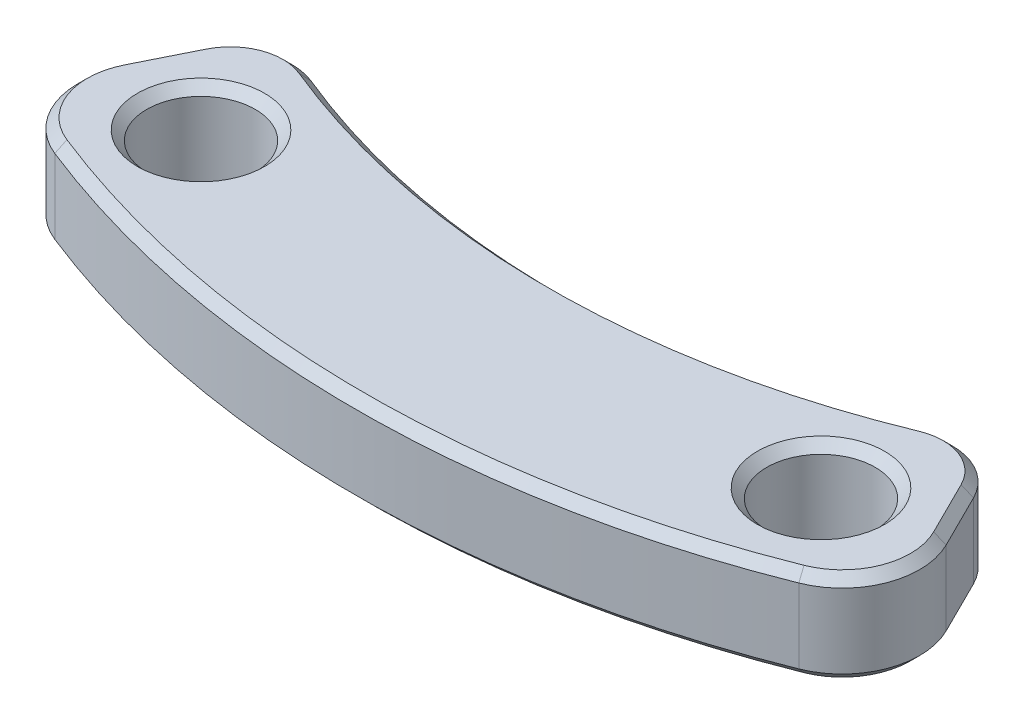
ISO-10303-21;
HEADER;
FILE_DESCRIPTION(('STEP AP214'),'2;1');
FILE_NAME('part.step','',(''),(''),'','','');
FILE_SCHEMA(('AUTOMOTIVE_DESIGN { 1 0 10303 214 1 1 1 1 }'));
ENDSEC;
DATA;
#1=APPLICATION_CONTEXT('core data for automotive mechanical design processes');
#2=APPLICATION_PROTOCOL_DEFINITION('international standard','automotive_design',2000,#1);
#3=PRODUCT_CONTEXT('',#1,'mechanical');
#4=PRODUCT('Part','Part','',(#3));
#5=PRODUCT_RELATED_PRODUCT_CATEGORY('part','',(#4));
#6=PRODUCT_DEFINITION_FORMATION('','',#4);
#7=PRODUCT_DEFINITION_CONTEXT('part definition',#1,'design');
#8=PRODUCT_DEFINITION('design','',#6,#7);
#9=PRODUCT_DEFINITION_SHAPE('','',#8);
#10=(LENGTH_UNIT() NAMED_UNIT(*) SI_UNIT(.MILLI.,.METRE.));
#11=(NAMED_UNIT(*) PLANE_ANGLE_UNIT() SI_UNIT($,.RADIAN.));
#12=(NAMED_UNIT(*) SI_UNIT($,.STERADIAN.) SOLID_ANGLE_UNIT());
#13=UNCERTAINTY_MEASURE_WITH_UNIT(LENGTH_MEASURE(1.E-05),#10,'distance_accuracy_value','');
#14=(GEOMETRIC_REPRESENTATION_CONTEXT(3) GLOBAL_UNCERTAINTY_ASSIGNED_CONTEXT((#13)) GLOBAL_UNIT_ASSIGNED_CONTEXT((#10,
#11,#12)) REPRESENTATION_CONTEXT('',''));
#15=CARTESIAN_POINT('',(0.,0.,0.));
#16=DIRECTION('',(0.,0.,1.));
#17=DIRECTION('',(1.,0.,0.));
#18=AXIS2_PLACEMENT_3D('',#15,#16,#17);
#19=CARTESIAN_POINT('',(15.4583046046748,3.,-0.411804340126796));
#20=DIRECTION('',(0.,1.,0.));
#21=DIRECTION('',(0.,0.,1.));
#22=AXIS2_PLACEMENT_3D('',#19,#20,#21);
#23=PLANE('',#22);
#24=CARTESIAN_POINT('',(14.3811814983377,3.,-0.804359974369999));
#25=DIRECTION('',(0.,1.,0.));
#26=DIRECTION('',(0.,0.,1.));
#27=AXIS2_PLACEMENT_3D('',#24,#25,#26);
#28=CIRCLE('',#27,2.04999999999999);
#29=CARTESIAN_POINT('',(14.3811814983377,3.,1.24564002562999));
#30=VERTEX_POINT('',#29);
#31=EDGE_CURVE('E326',#30,#30,#28,.F.);
#32=ORIENTED_EDGE('',*,*,#31,.T.);
#33=EDGE_LOOP('',(#32));
#34=FACE_BOUND('',#33,.T.);
#35=CARTESIAN_POINT('',(-5.61881850166235,3.,-0.804359974369999));
#36=DIRECTION('',(0.,1.,0.));
#37=DIRECTION('',(0.,0.,1.));
#38=AXIS2_PLACEMENT_3D('',#35,#36,#37);
#39=CIRCLE('',#38,2.04999999999999);
#40=CARTESIAN_POINT('',(-5.61881850166235,3.,1.24564002562999));
#41=VERTEX_POINT('',#40);
#42=EDGE_CURVE('E323',#41,#41,#39,.F.);
#43=ORIENTED_EDGE('',*,*,#42,.T.);
#44=EDGE_LOOP('',(#43));
#45=FACE_BOUND('',#44,.T.);
#46=CARTESIAN_POINT('',(-6.69594160799948,3.,-0.411804340126796));
#47=DIRECTION('',(0.,1.,0.));
#48=DIRECTION('',(0.,0.,1.));
#49=AXIS2_PLACEMENT_3D('',#46,#47,#48);
#50=CIRCLE('',#49,2.20000000000001);
#51=CARTESIAN_POINT('',(-8.66567382735264,3.,-1.39167932401103));
#52=VERTEX_POINT('',#51);
#53=CARTESIAN_POINT('',(-7.50826396913086,3.,1.63273286462297));
#54=VERTEX_POINT('',#53);
#55=EDGE_CURVE('E316',#52,#54,#50,.T.);
#56=ORIENTED_EDGE('',*,*,#55,.T.);
#57=CARTESIAN_POINT('',(4.38118149833765,3.,-28.2918571321689));
#58=DIRECTION('',(0.,1.,0.));
#59=DIRECTION('',(0.,0.,1.));
#60=AXIS2_PLACEMENT_3D('',#57,#58,#59);
#61=CIRCLE('',#60,32.2);
#62=CARTESIAN_POINT('',(16.2706269658062,3.,1.63273286462296));
#63=VERTEX_POINT('',#62);
#64=EDGE_CURVE('E320',#54,#63,#61,.T.);
#65=ORIENTED_EDGE('',*,*,#64,.T.);
#66=CARTESIAN_POINT('',(15.4583046046748,3.,-0.411804340126796));
#67=DIRECTION('',(0.,1.,0.));
#68=DIRECTION('',(0.,0.,1.));
#69=AXIS2_PLACEMENT_3D('',#66,#67,#68);
#70=CIRCLE('',#69,2.20000000000001);
#71=CARTESIAN_POINT('',(17.4280368240279,3.,-1.39167932401102));
#72=VERTEX_POINT('',#71);
#73=EDGE_CURVE('E318',#63,#72,#70,.T.);
#74=ORIENTED_EDGE('',*,*,#73,.T.);
#75=DIRECTION('',(-0.445397719947376,0.,-0.895332826978705));
#76=VECTOR('',#75,1.);
#77=CARTESIAN_POINT('',(16.5518630028291,3.,-3.15295278619088));
#78=LINE('',#77,#76);
#79=CARTESIAN_POINT('',(16.5518630028291,3.,-3.15295278619088));
#80=VERTEX_POINT('',#79);
#81=EDGE_CURVE('E314',#72,#80,#78,.T.);
#82=ORIENTED_EDGE('',*,*,#81,.T.);
#83=CARTESIAN_POINT('',(15.0297971969653,3.,-2.39577666228034));
#84=DIRECTION('',(0.,1.,0.));
#85=DIRECTION('',(0.,0.,1.));
#86=AXIS2_PLACEMENT_3D('',#83,#84,#85);
#87=CIRCLE('',#86,1.70000000000001);
#88=CARTESIAN_POINT('',(14.3832741009771,3.,-3.96803869080929));
#89=VERTEX_POINT('',#88);
#90=EDGE_CURVE('E310',#80,#89,#87,.T.);
#91=ORIENTED_EDGE('',*,*,#90,.T.);
#92=CARTESIAN_POINT('',(4.38118149833765,3.,-28.2918571321689));
#93=DIRECTION('',(0.,1.,0.));
#94=DIRECTION('',(0.,0.,1.));
#95=AXIS2_PLACEMENT_3D('',#92,#93,#94);
#96=CIRCLE('',#95,26.3);
#97=CARTESIAN_POINT('',(-5.62091110430185,3.,-3.96803869080929));
#98=VERTEX_POINT('',#97);
#99=EDGE_CURVE('E306',#89,#98,#96,.F.);
#100=ORIENTED_EDGE('',*,*,#99,.T.);
#101=CARTESIAN_POINT('',(-6.26743420028995,3.,-2.39577666228034));
#102=DIRECTION('',(0.,1.,0.));
#103=DIRECTION('',(0.,0.,1.));
#104=AXIS2_PLACEMENT_3D('',#101,#102,#103);
#105=CIRCLE('',#104,1.70000000000001);
#106=CARTESIAN_POINT('',(-7.78950000615376,3.,-3.15295278619088));
#107=VERTEX_POINT('',#106);
#108=EDGE_CURVE('E308',#98,#107,#105,.T.);
#109=ORIENTED_EDGE('',*,*,#108,.T.);
#110=DIRECTION('',(-0.445397719947375,0.,0.895332826978705));
#111=VECTOR('',#110,1.);
#112=CARTESIAN_POINT('',(-8.66567382735264,3.,-1.39167932401103));
#113=LINE('',#112,#111);
#114=EDGE_CURVE('E312',#107,#52,#113,.T.);
#115=ORIENTED_EDGE('',*,*,#114,.T.);
#116=EDGE_LOOP('',(#56,#65,#74,#82,#91,#100,#109,#115));
#117=FACE_BOUND('',#116,.T.);
#118=ADVANCED_FACE('F41',(#34,#45,#117),#23,.T.);
#119=CARTESIAN_POINT('',(15.4583046046748,0.,-0.411804340126796));
#120=DIRECTION('',(0.,1.,0.));
#121=DIRECTION('',(0.,0.,1.));
#122=AXIS2_PLACEMENT_3D('',#119,#120,#121);
#123=PLANE('',#122);
#124=CARTESIAN_POINT('',(14.3811814983377,0.,-0.804359974369999));
#125=DIRECTION('',(0.,1.,0.));
#126=DIRECTION('',(0.,0.,1.));
#127=AXIS2_PLACEMENT_3D('',#124,#125,#126);
#128=CIRCLE('',#127,2.04999999999999);
#129=CARTESIAN_POINT('',(14.3811814983377,0.,1.24564002562999));
#130=VERTEX_POINT('',#129);
#131=EDGE_CURVE('E297',#130,#130,#128,.T.);
#132=ORIENTED_EDGE('',*,*,#131,.T.);
#133=EDGE_LOOP('',(#132));
#134=FACE_BOUND('',#133,.T.);
#135=CARTESIAN_POINT('',(-5.61881850166235,0.,-0.804359974369999));
#136=DIRECTION('',(0.,1.,0.));
#137=DIRECTION('',(0.,0.,1.));
#138=AXIS2_PLACEMENT_3D('',#135,#136,#137);
#139=CIRCLE('',#138,2.05);
#140=CARTESIAN_POINT('',(-5.61881850166235,0.,1.24564002563));
#141=VERTEX_POINT('',#140);
#142=EDGE_CURVE('E294',#141,#141,#139,.T.);
#143=ORIENTED_EDGE('',*,*,#142,.T.);
#144=EDGE_LOOP('',(#143));
#145=FACE_BOUND('',#144,.T.);
#146=CARTESIAN_POINT('',(-6.26743420028995,0.,-2.39577666228034));
#147=DIRECTION('',(0.,1.,0.));
#148=DIRECTION('',(0.,0.,1.));
#149=AXIS2_PLACEMENT_3D('',#146,#147,#148);
#150=CIRCLE('',#149,1.7);
#151=CARTESIAN_POINT('',(-7.78950000615376,0.,-3.15295278619088));
#152=VERTEX_POINT('',#151);
#153=CARTESIAN_POINT('',(-5.62091110430185,0.,-3.96803869080928));
#154=VERTEX_POINT('',#153);
#155=EDGE_CURVE('E289',#152,#154,#150,.F.);
#156=ORIENTED_EDGE('',*,*,#155,.T.);
#157=CARTESIAN_POINT('',(4.38118149833765,0.,-28.2918571321689));
#158=DIRECTION('',(0.,1.,0.));
#159=DIRECTION('',(0.,0.,1.));
#160=AXIS2_PLACEMENT_3D('',#157,#158,#159);
#161=CIRCLE('',#160,26.3);
#162=CARTESIAN_POINT('',(14.3832741009772,0.,-3.96803869080929));
#163=VERTEX_POINT('',#162);
#164=EDGE_CURVE('E291',#154,#163,#161,.T.);
#165=ORIENTED_EDGE('',*,*,#164,.T.);
#166=CARTESIAN_POINT('',(15.0297971969653,0.,-2.39577666228034));
#167=DIRECTION('',(0.,1.,0.));
#168=DIRECTION('',(0.,0.,1.));
#169=AXIS2_PLACEMENT_3D('',#166,#167,#168);
#170=CIRCLE('',#169,1.7);
#171=CARTESIAN_POINT('',(16.551863002829,0.,-3.15295278619088));
#172=VERTEX_POINT('',#171);
#173=EDGE_CURVE('E287',#163,#172,#170,.F.);
#174=ORIENTED_EDGE('',*,*,#173,.T.);
#175=DIRECTION('',(0.445397719947376,0.,0.895332826978705));
#176=VECTOR('',#175,1.);
#177=CARTESIAN_POINT('',(17.4280368240279,0.,-1.39167932401102));
#178=LINE('',#177,#176);
#179=CARTESIAN_POINT('',(17.4280368240279,0.,-1.39167932401102));
#180=VERTEX_POINT('',#179);
#181=EDGE_CURVE('E162',#172,#180,#178,.T.);
#182=ORIENTED_EDGE('',*,*,#181,.T.);
#183=CARTESIAN_POINT('',(15.4583046046748,0.,-0.411804340126796));
#184=DIRECTION('',(0.,1.,0.));
#185=DIRECTION('',(0.,0.,1.));
#186=AXIS2_PLACEMENT_3D('',#183,#184,#185);
#187=CIRCLE('',#186,2.2);
#188=CARTESIAN_POINT('',(16.2706269658062,0.,1.63273286462295));
#189=VERTEX_POINT('',#188);
#190=EDGE_CURVE('E156',#180,#189,#187,.F.);
#191=ORIENTED_EDGE('',*,*,#190,.T.);
#192=CARTESIAN_POINT('',(4.38118149833765,0.,-28.2918571321689));
#193=DIRECTION('',(0.,1.,0.));
#194=DIRECTION('',(0.,0.,1.));
#195=AXIS2_PLACEMENT_3D('',#192,#193,#194);
#196=CIRCLE('',#195,32.2);
#197=CARTESIAN_POINT('',(-7.50826396913086,0.,1.63273286462295));
#198=VERTEX_POINT('',#197);
#199=EDGE_CURVE('E159',#189,#198,#196,.F.);
#200=ORIENTED_EDGE('',*,*,#199,.T.);
#201=CARTESIAN_POINT('',(-6.69594160799948,0.,-0.411804340126796));
#202=DIRECTION('',(0.,1.,0.));
#203=DIRECTION('',(0.,0.,1.));
#204=AXIS2_PLACEMENT_3D('',#201,#202,#203);
#205=CIRCLE('',#204,2.2);
#206=CARTESIAN_POINT('',(-8.66567382735263,0.,-1.39167932401102));
#207=VERTEX_POINT('',#206);
#208=EDGE_CURVE('E167',#198,#207,#205,.F.);
#209=ORIENTED_EDGE('',*,*,#208,.T.);
#210=DIRECTION('',(0.445397719947375,0.,-0.895332826978705));
#211=VECTOR('',#210,1.);
#212=CARTESIAN_POINT('',(-4.27073376148586,0.,-10.2263318993305));
#213=LINE('',#212,#211);
#214=EDGE_CURVE('E285',#207,#152,#213,.T.);
#215=ORIENTED_EDGE('',*,*,#214,.T.);
#216=EDGE_LOOP('',(#156,#165,#174,#182,#191,#200,#209,#215));
#217=FACE_BOUND('',#216,.T.);
#218=ADVANCED_FACE('F158',(#134,#145,#217),#123,.F.);
#219=CARTESIAN_POINT('',(15.4583046046748,3.,-0.411804340126796));
#220=DIRECTION('',(0.,-1.,0.));
#221=DIRECTION('',(0.,0.,-1.));
#222=AXIS2_PLACEMENT_3D('',#219,#220,#221);
#223=CYLINDRICAL_SURFACE('',#222,2.5);
#224=DIRECTION('',(0.,-1.,0.));
#225=VECTOR('',#224,1.);
#226=CARTESIAN_POINT('',(16.3813981968695,3.,1.91153339254338));
#227=LINE('',#226,#225);
#228=CARTESIAN_POINT('',(16.3813981968695,2.70000000000001,1.91153339254338));
#229=VERTEX_POINT('',#228);
#230=CARTESIAN_POINT('',(16.3813981968695,0.300000000000002,1.91153339254338));
#231=VERTEX_POINT('',#230);
#232=EDGE_CURVE('E181',#229,#231,#227,.T.);
#233=ORIENTED_EDGE('',*,*,#232,.T.);
#234=CARTESIAN_POINT('',(15.4583046046748,0.300000000000002,-0.411804340126796));
#235=DIRECTION('',(0.,1.,0.));
#236=DIRECTION('',(0.,0.,1.));
#237=AXIS2_PLACEMENT_3D('',#234,#235,#236);
#238=CIRCLE('',#237,2.5);
#239=CARTESIAN_POINT('',(17.6966366721215,0.300000000000002,-1.52529863999523));
#240=VERTEX_POINT('',#239);
#241=EDGE_CURVE('E180',#231,#240,#238,.T.);
#242=ORIENTED_EDGE('',*,*,#241,.T.);
#243=DIRECTION('',(0.,-1.,0.));
#244=VECTOR('',#243,1.);
#245=CARTESIAN_POINT('',(17.6966366721215,3.,-1.52529863999523));
#246=LINE('',#245,#244);
#247=CARTESIAN_POINT('',(17.6966366721215,2.70000000000001,-1.52529863999523));
#248=VERTEX_POINT('',#247);
#249=EDGE_CURVE('E177',#248,#240,#246,.T.);
#250=ORIENTED_EDGE('',*,*,#249,.F.);
#251=CARTESIAN_POINT('',(15.4583046046748,2.70000000000001,-0.411804340126796));
#252=DIRECTION('',(0.,1.,0.));
#253=DIRECTION('',(0.,0.,1.));
#254=AXIS2_PLACEMENT_3D('',#251,#252,#253);
#255=CIRCLE('',#254,2.5);
#256=EDGE_CURVE('E64',#248,#229,#255,.F.);
#257=ORIENTED_EDGE('',*,*,#256,.T.);
#258=EDGE_LOOP('',(#233,#242,#250,#257));
#259=FACE_BOUND('',#258,.T.);
#260=ADVANCED_FACE('F404',(#259),#223,.T.);
#261=CARTESIAN_POINT('',(16.8204628509227,3.,-3.28657210217509));
#262=DIRECTION('',(-0.895332826978705,0.,0.445397719947376));
#263=DIRECTION('',(0.445397719947376,0.,0.895332826978705));
#264=AXIS2_PLACEMENT_3D('',#261,#262,#263);
#265=PLANE('',#264);
#266=ORIENTED_EDGE('',*,*,#249,.T.);
#267=DIRECTION('',(-0.445397719947376,0.,-0.895332826978705));
#268=VECTOR('',#267,1.);
#269=CARTESIAN_POINT('',(16.8204628509227,0.300000000000002,-3.28657210217509));
#270=LINE('',#269,#268);
#271=CARTESIAN_POINT('',(16.8204628509227,0.300000000000002,-3.28657210217509));
#272=VERTEX_POINT('',#271);
#273=EDGE_CURVE('E238',#240,#272,#270,.T.);
#274=ORIENTED_EDGE('',*,*,#273,.T.);
#275=DIRECTION('',(0.,-1.,0.));
#276=VECTOR('',#275,1.);
#277=CARTESIAN_POINT('',(16.8204628509227,3.,-3.28657210217509));
#278=LINE('',#277,#276);
#279=CARTESIAN_POINT('',(16.8204628509227,2.70000000000001,-3.28657210217509));
#280=VERTEX_POINT('',#279);
#281=EDGE_CURVE('E280',#280,#272,#278,.T.);
#282=ORIENTED_EDGE('',*,*,#281,.F.);
#283=DIRECTION('',(0.445397719947376,0.,0.895332826978705));
#284=VECTOR('',#283,1.);
#285=CARTESIAN_POINT('',(17.6966366721215,2.70000000000001,-1.52529863999523));
#286=LINE('',#285,#284);
#287=EDGE_CURVE('E245',#280,#248,#286,.T.);
#288=ORIENTED_EDGE('',*,*,#287,.T.);
#289=EDGE_LOOP('',(#266,#274,#282,#288));
#290=FACE_BOUND('',#289,.T.);
#291=ADVANCED_FACE('F424',(#290),#265,.F.);
#292=CARTESIAN_POINT('',(15.0297971969653,3.,-2.39577666228034));
#293=DIRECTION('',(0.,-1.,0.));
#294=DIRECTION('',(0.,0.,-1.));
#295=AXIS2_PLACEMENT_3D('',#292,#293,#294);
#296=CYLINDRICAL_SURFACE('',#295,2.);
#297=ORIENTED_EDGE('',*,*,#281,.T.);
#298=CARTESIAN_POINT('',(15.0297971969653,0.300000000000002,-2.39577666228034));
#299=DIRECTION('',(0.,1.,0.));
#300=DIRECTION('',(0.,0.,1.));
#301=AXIS2_PLACEMENT_3D('',#298,#299,#300);
#302=CIRCLE('',#301,2.);
#303=CARTESIAN_POINT('',(14.2691817899204,0.300000000000002,-4.24549669584381));
#304=VERTEX_POINT('',#303);
#305=EDGE_CURVE('E346',#272,#304,#302,.T.);
#306=ORIENTED_EDGE('',*,*,#305,.T.);
#307=DIRECTION('',(0.,-1.,0.));
#308=VECTOR('',#307,1.);
#309=CARTESIAN_POINT('',(14.2691817899204,3.,-4.24549669584381));
#310=LINE('',#309,#308);
#311=CARTESIAN_POINT('',(14.2691817899204,2.70000000000001,-4.24549669584381));
#312=VERTEX_POINT('',#311);
#313=EDGE_CURVE('E277',#312,#304,#310,.T.);
#314=ORIENTED_EDGE('',*,*,#313,.F.);
#315=CARTESIAN_POINT('',(15.0297971969653,2.70000000000001,-2.39577666228034));
#316=DIRECTION('',(0.,1.,0.));
#317=DIRECTION('',(0.,0.,1.));
#318=AXIS2_PLACEMENT_3D('',#315,#316,#317);
#319=CIRCLE('',#318,2.);
#320=EDGE_CURVE('E344',#312,#280,#319,.F.);
#321=ORIENTED_EDGE('',*,*,#320,.T.);
#322=EDGE_LOOP('',(#297,#306,#314,#321));
#323=FACE_BOUND('',#322,.T.);
#324=ADVANCED_FACE('F386',(#323),#296,.T.);
#325=CARTESIAN_POINT('',(4.38118149833765,3.,-28.2918571321689));
#326=DIRECTION('',(0.,-1.,0.));
#327=DIRECTION('',(0.,0.,-1.));
#328=AXIS2_PLACEMENT_3D('',#325,#326,#327);
#329=CYLINDRICAL_SURFACE('',#328,26.);
#330=ORIENTED_EDGE('',*,*,#313,.T.);
#331=CARTESIAN_POINT('',(4.38118149833765,0.300000000000002,-28.2918571321689));
#332=DIRECTION('',(0.,1.,0.));
#333=DIRECTION('',(0.,0.,1.));
#334=AXIS2_PLACEMENT_3D('',#331,#332,#333);
#335=CIRCLE('',#334,26.);
#336=CARTESIAN_POINT('',(-5.50681879324512,0.300000000000002,-4.24549669584381));
#337=VERTEX_POINT('',#336);
#338=EDGE_CURVE('E337',#304,#337,#335,.F.);
#339=ORIENTED_EDGE('',*,*,#338,.T.);
#340=DIRECTION('',(0.,-1.,0.));
#341=VECTOR('',#340,1.);
#342=CARTESIAN_POINT('',(-5.50681879324512,3.,-4.24549669584381));
#343=LINE('',#342,#341);
#344=CARTESIAN_POINT('',(-5.50681879324512,2.70000000000001,-4.24549669584381));
#345=VERTEX_POINT('',#344);
#346=EDGE_CURVE('E274',#345,#337,#343,.T.);
#347=ORIENTED_EDGE('',*,*,#346,.F.);
#348=CARTESIAN_POINT('',(4.38118149833765,2.70000000000001,-28.2918571321689));
#349=DIRECTION('',(0.,1.,0.));
#350=DIRECTION('',(0.,0.,1.));
#351=AXIS2_PLACEMENT_3D('',#348,#349,#350);
#352=CIRCLE('',#351,26.);
#353=EDGE_CURVE('E335',#345,#312,#352,.T.);
#354=ORIENTED_EDGE('',*,*,#353,.T.);
#355=EDGE_LOOP('',(#330,#339,#347,#354));
#356=FACE_BOUND('',#355,.T.);
#357=ADVANCED_FACE('F370',(#356),#329,.F.);
#358=CARTESIAN_POINT('',(-6.26743420028995,3.,-2.39577666228034));
#359=DIRECTION('',(0.,-1.,0.));
#360=DIRECTION('',(0.,0.,-1.));
#361=AXIS2_PLACEMENT_3D('',#358,#359,#360);
#362=CYLINDRICAL_SURFACE('',#361,2.);
#363=ORIENTED_EDGE('',*,*,#346,.T.);
#364=CARTESIAN_POINT('',(-6.26743420028995,0.300000000000002,-2.39577666228034));
#365=DIRECTION('',(0.,1.,0.));
#366=DIRECTION('',(0.,0.,1.));
#367=AXIS2_PLACEMENT_3D('',#364,#365,#366);
#368=CIRCLE('',#367,2.);
#369=CARTESIAN_POINT('',(-8.05809985424736,0.300000000000002,-3.28657210217509));
#370=VERTEX_POINT('',#369);
#371=EDGE_CURVE('E342',#337,#370,#368,.T.);
#372=ORIENTED_EDGE('',*,*,#371,.T.);
#373=DIRECTION('',(0.,-1.,0.));
#374=VECTOR('',#373,1.);
#375=CARTESIAN_POINT('',(-8.05809985424736,3.,-3.28657210217509));
#376=LINE('',#375,#374);
#377=CARTESIAN_POINT('',(-8.05809985424736,2.70000000000001,-3.28657210217509));
#378=VERTEX_POINT('',#377);
#379=EDGE_CURVE('E269',#378,#370,#376,.T.);
#380=ORIENTED_EDGE('',*,*,#379,.F.);
#381=CARTESIAN_POINT('',(-6.26743420028995,2.70000000000001,-2.39577666228034));
#382=DIRECTION('',(0.,1.,0.));
#383=DIRECTION('',(0.,0.,1.));
#384=AXIS2_PLACEMENT_3D('',#381,#382,#383);
#385=CIRCLE('',#384,2.);
#386=EDGE_CURVE('E340',#378,#345,#385,.F.);
#387=ORIENTED_EDGE('',*,*,#386,.T.);
#388=EDGE_LOOP('',(#363,#372,#380,#387));
#389=FACE_BOUND('',#388,.T.);
#390=ADVANCED_FACE('F373',(#389),#362,.T.);
#391=CARTESIAN_POINT('',(-8.05809985424736,3.,-3.28657210217509));
#392=DIRECTION('',(0.895332826978705,0.,0.445397719947375));
#393=DIRECTION('',(0.445397719947375,0.,-0.895332826978705));
#394=AXIS2_PLACEMENT_3D('',#391,#392,#393);
#395=PLANE('',#394);
#396=ORIENTED_EDGE('',*,*,#379,.T.);
#397=DIRECTION('',(-0.445397719947375,0.,0.895332826978705));
#398=VECTOR('',#397,1.);
#399=CARTESIAN_POINT('',(-8.05809985424736,0.300000000000002,-3.28657210217509));
#400=LINE('',#399,#398);
#401=CARTESIAN_POINT('',(-8.93427367544624,0.300000000000002,-1.52529863999523));
#402=VERTEX_POINT('',#401);
#403=EDGE_CURVE('E249',#370,#402,#400,.T.);
#404=ORIENTED_EDGE('',*,*,#403,.T.);
#405=DIRECTION('',(0.,-1.,0.));
#406=VECTOR('',#405,1.);
#407=CARTESIAN_POINT('',(-8.93427367544624,3.,-1.52529863999523));
#408=LINE('',#407,#406);
#409=CARTESIAN_POINT('',(-8.93427367544624,2.70000000000001,-1.52529863999523));
#410=VERTEX_POINT('',#409);
#411=EDGE_CURVE('E267',#410,#402,#408,.T.);
#412=ORIENTED_EDGE('',*,*,#411,.F.);
#413=DIRECTION('',(0.445397719947375,0.,-0.895332826978705));
#414=VECTOR('',#413,1.);
#415=CARTESIAN_POINT('',(-8.05809985424736,2.70000000000001,-3.28657210217509));
#416=LINE('',#415,#414);
#417=EDGE_CURVE('E348',#410,#378,#416,.T.);
#418=ORIENTED_EDGE('',*,*,#417,.T.);
#419=EDGE_LOOP('',(#396,#404,#412,#418));
#420=FACE_BOUND('',#419,.T.);
#421=ADVANCED_FACE('F351',(#420),#395,.F.);
#422=CARTESIAN_POINT('',(-6.69594160799948,3.,-0.411804340126796));
#423=DIRECTION('',(0.,-1.,0.));
#424=DIRECTION('',(0.,0.,-1.));
#425=AXIS2_PLACEMENT_3D('',#422,#423,#424);
#426=CYLINDRICAL_SURFACE('',#425,2.5);
#427=ORIENTED_EDGE('',*,*,#411,.T.);
#428=CARTESIAN_POINT('',(-6.69594160799948,0.300000000000002,-0.411804340126796));
#429=DIRECTION('',(0.,1.,0.));
#430=DIRECTION('',(0.,0.,1.));
#431=AXIS2_PLACEMENT_3D('',#428,#429,#430);
#432=CIRCLE('',#431,2.5);
#433=CARTESIAN_POINT('',(-7.61903520019423,0.300000000000002,1.91153339254338));
#434=VERTEX_POINT('',#433);
#435=EDGE_CURVE('E247',#402,#434,#432,.T.);
#436=ORIENTED_EDGE('',*,*,#435,.T.);
#437=DIRECTION('',(0.,-1.,0.));
#438=VECTOR('',#437,1.);
#439=CARTESIAN_POINT('',(-7.61903520019423,3.,1.91153339254338));
#440=LINE('',#439,#438);
#441=CARTESIAN_POINT('',(-7.61903520019423,2.70000000000001,1.91153339254338));
#442=VERTEX_POINT('',#441);
#443=EDGE_CURVE('E183',#442,#434,#440,.T.);
#444=ORIENTED_EDGE('',*,*,#443,.F.);
#445=CARTESIAN_POINT('',(-6.69594160799948,2.70000000000001,-0.411804340126796));
#446=DIRECTION('',(0.,1.,0.));
#447=DIRECTION('',(0.,0.,1.));
#448=AXIS2_PLACEMENT_3D('',#445,#446,#447);
#449=CIRCLE('',#448,2.5);
#450=EDGE_CURVE('E244',#442,#410,#449,.F.);
#451=ORIENTED_EDGE('',*,*,#450,.T.);
#452=EDGE_LOOP('',(#427,#436,#444,#451));
#453=FACE_BOUND('',#452,.T.);
#454=ADVANCED_FACE('F263',(#453),#426,.T.);
#455=CARTESIAN_POINT('',(4.38118149833765,3.,-28.2918571321689));
#456=DIRECTION('',(0.,-1.,0.));
#457=DIRECTION('',(0.,0.,-1.));
#458=AXIS2_PLACEMENT_3D('',#455,#456,#457);
#459=CYLINDRICAL_SURFACE('',#458,32.5);
#460=ORIENTED_EDGE('',*,*,#443,.T.);
#461=CARTESIAN_POINT('',(4.38118149833765,0.300000000000002,-28.2918571321689));
#462=DIRECTION('',(0.,1.,0.));
#463=DIRECTION('',(0.,0.,1.));
#464=AXIS2_PLACEMENT_3D('',#461,#462,#463);
#465=CIRCLE('',#464,32.5);
#466=EDGE_CURVE('E11',#434,#231,#465,.T.);
#467=ORIENTED_EDGE('',*,*,#466,.T.);
#468=ORIENTED_EDGE('',*,*,#232,.F.);
#469=CARTESIAN_POINT('',(4.38118149833765,2.70000000000001,-28.2918571321689));
#470=DIRECTION('',(0.,1.,0.));
#471=DIRECTION('',(0.,0.,1.));
#472=AXIS2_PLACEMENT_3D('',#469,#470,#471);
#473=CIRCLE('',#472,32.5);
#474=EDGE_CURVE('E51',#229,#442,#473,.F.);
#475=ORIENTED_EDGE('',*,*,#474,.T.);
#476=EDGE_LOOP('',(#460,#467,#468,#475));
#477=FACE_BOUND('',#476,.T.);
#478=ADVANCED_FACE('F258',(#477),#459,.T.);
#479=CARTESIAN_POINT('',(-5.61881850166235,3.,-0.804359974369999));
#480=DIRECTION('',(0.,-1.,0.));
#481=DIRECTION('',(0.,0.,-1.));
#482=AXIS2_PLACEMENT_3D('',#479,#480,#481);
#483=CYLINDRICAL_SURFACE('',#482,1.75);
#484=CARTESIAN_POINT('',(-5.61881850166235,0.299999999999999,-0.804359974369999));
#485=DIRECTION('',(0.,1.,0.));
#486=DIRECTION('',(0.,0.,1.));
#487=AXIS2_PLACEMENT_3D('',#484,#485,#486);
#488=CIRCLE('',#487,1.75);
#489=CARTESIAN_POINT('',(-5.61881850166235,0.299999999999999,0.945640025630001));
#490=VERTEX_POINT('',#489);
#491=EDGE_CURVE('E332',#490,#490,#488,.F.);
#492=ORIENTED_EDGE('',*,*,#491,.T.);
#493=EDGE_LOOP('',(#492));
#494=FACE_BOUND('',#493,.T.);
#495=CARTESIAN_POINT('',(-5.61881850166235,2.70000000000001,-0.804359974369999));
#496=DIRECTION('',(0.,1.,0.));
#497=DIRECTION('',(0.,0.,1.));
#498=AXIS2_PLACEMENT_3D('',#495,#496,#497);
#499=CIRCLE('',#498,1.75);
#500=CARTESIAN_POINT('',(-5.61881850166235,2.70000000000001,0.945640025630001));
#501=VERTEX_POINT('',#500);
#502=EDGE_CURVE('E329',#501,#501,#499,.T.);
#503=ORIENTED_EDGE('',*,*,#502,.T.);
#504=EDGE_LOOP('',(#503));
#505=FACE_BOUND('',#504,.T.);
#506=ADVANCED_FACE('F409',(#494,#505),#483,.F.);
#507=CARTESIAN_POINT('',(14.3811814983377,3.,-0.804359974369999));
#508=DIRECTION('',(0.,-1.,0.));
#509=DIRECTION('',(0.,0.,-1.));
#510=AXIS2_PLACEMENT_3D('',#507,#508,#509);
#511=CYLINDRICAL_SURFACE('',#510,1.75);
#512=CARTESIAN_POINT('',(14.3811814983377,0.299999999999997,-0.804359974369999));
#513=DIRECTION('',(0.,1.,0.));
#514=DIRECTION('',(0.,0.,1.));
#515=AXIS2_PLACEMENT_3D('',#512,#513,#514);
#516=CIRCLE('',#515,1.75);
#517=CARTESIAN_POINT('',(14.3811814983377,0.299999999999997,0.945640025629999));
#518=VERTEX_POINT('',#517);
#519=EDGE_CURVE('E303',#518,#518,#516,.F.);
#520=ORIENTED_EDGE('',*,*,#519,.T.);
#521=EDGE_LOOP('',(#520));
#522=FACE_BOUND('',#521,.T.);
#523=CARTESIAN_POINT('',(14.3811814983377,2.70000000000001,-0.804359974369999));
#524=DIRECTION('',(0.,1.,0.));
#525=DIRECTION('',(0.,0.,1.));
#526=AXIS2_PLACEMENT_3D('',#523,#524,#525);
#527=CIRCLE('',#526,1.75);
#528=CARTESIAN_POINT('',(14.3811814983377,2.70000000000001,0.945640025629999));
#529=VERTEX_POINT('',#528);
#530=EDGE_CURVE('E300',#529,#529,#527,.T.);
#531=ORIENTED_EDGE('',*,*,#530,.T.);
#532=EDGE_LOOP('',(#531));
#533=FACE_BOUND('',#532,.T.);
#534=ADVANCED_FACE('F437',(#522,#533),#511,.F.);
#535=CARTESIAN_POINT('',(14.3811814983377,0.,-0.804359974369999));
#536=DIRECTION('',(0.,-1.,0.));
#537=DIRECTION('',(0.,0.,-1.));
#538=AXIS2_PLACEMENT_3D('',#535,#536,#537);
#539=CONICAL_SURFACE('',#538,2.04999999999999,0.785398163397444);
#540=ORIENTED_EDGE('',*,*,#519,.F.);
#541=EDGE_LOOP('',(#540));
#542=FACE_BOUND('',#541,.T.);
#543=ORIENTED_EDGE('',*,*,#131,.F.);
#544=EDGE_LOOP('',(#543));
#545=FACE_BOUND('',#544,.T.);
#546=ADVANCED_FACE('F430',(#542,#545),#539,.F.);
#547=CARTESIAN_POINT('',(14.3811814983377,2.70000000000001,-0.804359974369999));
#548=DIRECTION('',(0.,1.,0.));
#549=DIRECTION('',(0.,0.,1.));
#550=AXIS2_PLACEMENT_3D('',#547,#548,#549);
#551=CONICAL_SURFACE('',#550,1.75,0.785398163397448);
#552=ORIENTED_EDGE('',*,*,#31,.F.);
#553=EDGE_LOOP('',(#552));
#554=FACE_BOUND('',#553,.T.);
#555=ORIENTED_EDGE('',*,*,#530,.F.);
#556=EDGE_LOOP('',(#555));
#557=FACE_BOUND('',#556,.T.);
#558=ADVANCED_FACE('F436',(#554,#557),#551,.F.);
#559=CARTESIAN_POINT('',(-5.61881850166235,0.,-0.804359974369999));
#560=DIRECTION('',(0.,-1.,0.));
#561=DIRECTION('',(0.,0.,-1.));
#562=AXIS2_PLACEMENT_3D('',#559,#560,#561);
#563=CONICAL_SURFACE('',#562,2.05,0.785398163397449);
#564=ORIENTED_EDGE('',*,*,#491,.F.);
#565=EDGE_LOOP('',(#564));
#566=FACE_BOUND('',#565,.T.);
#567=ORIENTED_EDGE('',*,*,#142,.F.);
#568=EDGE_LOOP('',(#567));
#569=FACE_BOUND('',#568,.T.);
#570=ADVANCED_FACE('F444',(#566,#569),#563,.F.);
#571=CARTESIAN_POINT('',(-5.61881850166235,2.70000000000001,-0.804359974369999));
#572=DIRECTION('',(0.,1.,0.));
#573=DIRECTION('',(0.,0.,1.));
#574=AXIS2_PLACEMENT_3D('',#571,#572,#573);
#575=CONICAL_SURFACE('',#574,1.75,0.785398163397448);
#576=ORIENTED_EDGE('',*,*,#42,.F.);
#577=EDGE_LOOP('',(#576));
#578=FACE_BOUND('',#577,.T.);
#579=ORIENTED_EDGE('',*,*,#502,.F.);
#580=EDGE_LOOP('',(#579));
#581=FACE_BOUND('',#580,.T.);
#582=ADVANCED_FACE('F451',(#578,#581),#575,.F.);
#583=CARTESIAN_POINT('',(4.38118149833765,0.300000000000002,-28.2918571321689));
#584=DIRECTION('',(0.,1.,0.));
#585=DIRECTION('',(0.,0.,1.));
#586=AXIS2_PLACEMENT_3D('',#583,#584,#585);
#587=CONICAL_SURFACE('',#586,32.5,0.785398163397448);
#588=DIRECTION('',(-0.261090295484306,0.70710678118654,0.657139146303071));
#589=VECTOR('',#588,1.);
#590=CARTESIAN_POINT('',(-7.50826396913086,0.,1.63273286462295));
#591=LINE('',#590,#589);
#592=EDGE_CURVE('E175',#198,#434,#591,.T.);
#593=ORIENTED_EDGE('',*,*,#592,.F.);
#594=ORIENTED_EDGE('',*,*,#199,.F.);
#595=DIRECTION('',(-0.261090295484307,-0.707106781186547,-0.657139146303062));
#596=VECTOR('',#595,1.);
#597=CARTESIAN_POINT('',(16.3813981968695,0.300000000000002,1.91153339254337));
#598=LINE('',#597,#596);
#599=EDGE_CURVE('E172',#231,#189,#598,.T.);
#600=ORIENTED_EDGE('',*,*,#599,.F.);
#601=ORIENTED_EDGE('',*,*,#466,.F.);
#602=EDGE_LOOP('',(#593,#594,#600,#601));
#603=FACE_BOUND('',#602,.T.);
#604=ADVANCED_FACE('F171',(#603),#587,.T.);
#605=CARTESIAN_POINT('',(15.4583046046748,0.300000000000002,-0.411804340126796));
#606=DIRECTION('',(0.,1.,0.));
#607=DIRECTION('',(0.,0.,1.));
#608=AXIS2_PLACEMENT_3D('',#605,#606,#607);
#609=CONICAL_SURFACE('',#608,2.5,0.785398163397448);
#610=ORIENTED_EDGE('',*,*,#599,.T.);
#611=ORIENTED_EDGE('',*,*,#190,.F.);
#612=DIRECTION('',(-0.633095913375561,-0.70710678118655,0.314943748099817));
#613=VECTOR('',#612,1.);
#614=CARTESIAN_POINT('',(17.6966366721215,0.300000000000002,-1.52529863999523));
#615=LINE('',#614,#613);
#616=EDGE_CURVE('E185',#240,#180,#615,.T.);
#617=ORIENTED_EDGE('',*,*,#616,.F.);
#618=ORIENTED_EDGE('',*,*,#241,.F.);
#619=EDGE_LOOP('',(#610,#611,#617,#618));
#620=FACE_BOUND('',#619,.T.);
#621=ADVANCED_FACE('F179',(#620),#609,.T.);
#622=CARTESIAN_POINT('',(-6.69594160799948,0.300000000000002,-0.411804340126796));
#623=DIRECTION('',(0.,1.,0.));
#624=DIRECTION('',(0.,0.,1.));
#625=AXIS2_PLACEMENT_3D('',#622,#623,#624);
#626=CONICAL_SURFACE('',#625,2.5,0.785398163397448);
#627=ORIENTED_EDGE('',*,*,#592,.T.);
#628=ORIENTED_EDGE('',*,*,#435,.F.);
#629=DIRECTION('',(-0.633095913375563,0.707106781186548,-0.314943748099816));
#630=VECTOR('',#629,1.);
#631=CARTESIAN_POINT('',(-8.66567382735263,0.,-1.39167932401102));
#632=LINE('',#631,#630);
#633=EDGE_CURVE('E232',#207,#402,#632,.T.);
#634=ORIENTED_EDGE('',*,*,#633,.F.);
#635=ORIENTED_EDGE('',*,*,#208,.F.);
#636=EDGE_LOOP('',(#627,#628,#634,#635));
#637=FACE_BOUND('',#636,.T.);
#638=ADVANCED_FACE('F358',(#637),#626,.T.);
#639=CARTESIAN_POINT('',(16.8204628509227,0.300000000000002,-3.28657210217509));
#640=DIRECTION('',(-0.633095913375563,0.707106781186548,0.314943748099816));
#641=DIRECTION('',(-0.445397719947376,0.,-0.895332826978705));
#642=AXIS2_PLACEMENT_3D('',#639,#640,#641);
#643=PLANE('',#642);
#644=ORIENTED_EDGE('',*,*,#616,.T.);
#645=ORIENTED_EDGE('',*,*,#181,.F.);
#646=DIRECTION('',(-0.633095913375565,-0.707106781186546,0.314943748099816));
#647=VECTOR('',#646,1.);
#648=CARTESIAN_POINT('',(16.8204628509227,0.300000000000002,-3.28657210217509));
#649=LINE('',#648,#647);
#650=EDGE_CURVE('E229',#272,#172,#649,.T.);
#651=ORIENTED_EDGE('',*,*,#650,.F.);
#652=ORIENTED_EDGE('',*,*,#273,.F.);
#653=EDGE_LOOP('',(#644,#645,#651,#652));
#654=FACE_BOUND('',#653,.T.);
#655=ADVANCED_FACE('F236',(#654),#643,.F.);
#656=CARTESIAN_POINT('',(-8.05809985424736,0.300000000000002,-3.28657210217509));
#657=DIRECTION('',(0.633095913375569,0.707106781186542,0.314943748099818));
#658=DIRECTION('',(-0.445397719947375,0.,0.895332826978705));
#659=AXIS2_PLACEMENT_3D('',#656,#657,#658);
#660=PLANE('',#659);
#661=ORIENTED_EDGE('',*,*,#633,.T.);
#662=ORIENTED_EDGE('',*,*,#403,.F.);
#663=DIRECTION('',(-0.633095913375559,0.707106781186553,-0.314943748099813));
#664=VECTOR('',#663,1.);
#665=CARTESIAN_POINT('',(-7.78950000615376,0.,-3.15295278619088));
#666=LINE('',#665,#664);
#667=EDGE_CURVE('E223',#152,#370,#666,.T.);
#668=ORIENTED_EDGE('',*,*,#667,.F.);
#669=ORIENTED_EDGE('',*,*,#214,.F.);
#670=EDGE_LOOP('',(#661,#662,#668,#669));
#671=FACE_BOUND('',#670,.T.);
#672=ADVANCED_FACE('F360',(#671),#660,.F.);
#673=CARTESIAN_POINT('',(15.0297971969653,0.300000000000002,-2.39577666228034));
#674=DIRECTION('',(0.,1.,0.));
#675=DIRECTION('',(0.,0.,1.));
#676=AXIS2_PLACEMENT_3D('',#673,#674,#675);
#677=CONICAL_SURFACE('',#676,2.,0.785398163397446);
#678=ORIENTED_EDGE('',*,*,#650,.T.);
#679=ORIENTED_EDGE('',*,*,#173,.F.);
#680=DIRECTION('',(0.268918156098183,-0.707106781186549,0.653974789514666));
#681=VECTOR('',#680,1.);
#682=CARTESIAN_POINT('',(14.2691817899204,0.300000000000002,-4.24549669584381));
#683=LINE('',#682,#681);
#684=EDGE_CURVE('E216',#304,#163,#683,.T.);
#685=ORIENTED_EDGE('',*,*,#684,.F.);
#686=ORIENTED_EDGE('',*,*,#305,.F.);
#687=EDGE_LOOP('',(#678,#679,#685,#686));
#688=FACE_BOUND('',#687,.T.);
#689=ADVANCED_FACE('F388',(#688),#677,.T.);
#690=CARTESIAN_POINT('',(-6.26743420028995,0.300000000000002,-2.39577666228034));
#691=DIRECTION('',(0.,1.,0.));
#692=DIRECTION('',(0.,0.,1.));
#693=AXIS2_PLACEMENT_3D('',#690,#691,#692);
#694=CONICAL_SURFACE('',#693,2.,0.785398163397449);
#695=ORIENTED_EDGE('',*,*,#667,.T.);
#696=ORIENTED_EDGE('',*,*,#371,.F.);
#697=DIRECTION('',(0.268918156098183,0.707106781186548,-0.653974789514667));
#698=VECTOR('',#697,1.);
#699=CARTESIAN_POINT('',(-5.62091110430185,0.,-3.96803869080928));
#700=LINE('',#699,#698);
#701=EDGE_CURVE('E211',#154,#337,#700,.T.);
#702=ORIENTED_EDGE('',*,*,#701,.F.);
#703=ORIENTED_EDGE('',*,*,#155,.F.);
#704=EDGE_LOOP('',(#695,#696,#702,#703));
#705=FACE_BOUND('',#704,.T.);
#706=ADVANCED_FACE('F366',(#705),#694,.T.);
#707=CARTESIAN_POINT('',(4.38118149833765,0.300000000000002,-28.2918571321689));
#708=DIRECTION('',(0.,-1.,0.));
#709=DIRECTION('',(0.,0.,-1.));
#710=AXIS2_PLACEMENT_3D('',#707,#708,#709);
#711=CONICAL_SURFACE('',#710,26.,0.785398163397448);
#712=ORIENTED_EDGE('',*,*,#684,.T.);
#713=ORIENTED_EDGE('',*,*,#164,.F.);
#714=ORIENTED_EDGE('',*,*,#701,.T.);
#715=ORIENTED_EDGE('',*,*,#338,.F.);
#716=EDGE_LOOP('',(#712,#713,#714,#715));
#717=FACE_BOUND('',#716,.T.);
#718=ADVANCED_FACE('F363',(#717),#711,.F.);
#719=CARTESIAN_POINT('',(4.38118149833765,3.,-28.2918571321689));
#720=DIRECTION('',(0.,1.,0.));
#721=DIRECTION('',(0.,0.,1.));
#722=AXIS2_PLACEMENT_3D('',#719,#720,#721);
#723=CONICAL_SURFACE('',#722,26.3,0.785398163397443);
#724=DIRECTION('',(0.268918156098185,0.707106781186547,0.653974789514667));
#725=VECTOR('',#724,1.);
#726=CARTESIAN_POINT('',(14.2691817899204,2.70000000000001,-4.24549669584381));
#727=LINE('',#726,#725);
#728=EDGE_CURVE('E204',#312,#89,#727,.T.);
#729=ORIENTED_EDGE('',*,*,#728,.F.);
#730=ORIENTED_EDGE('',*,*,#353,.F.);
#731=DIRECTION('',(0.268918156098183,-0.707106781186547,-0.653974789514667));
#732=VECTOR('',#731,1.);
#733=CARTESIAN_POINT('',(-5.62091110430185,3.,-3.96803869080929));
#734=LINE('',#733,#732);
#735=EDGE_CURVE('E46',#98,#345,#734,.T.);
#736=ORIENTED_EDGE('',*,*,#735,.F.);
#737=ORIENTED_EDGE('',*,*,#99,.F.);
#738=EDGE_LOOP('',(#729,#730,#736,#737));
#739=FACE_BOUND('',#738,.T.);
#740=ADVANCED_FACE('F44',(#739),#723,.F.);
#741=CARTESIAN_POINT('',(-6.26743420028995,3.,-2.39577666228034));
#742=DIRECTION('',(0.,-1.,0.));
#743=DIRECTION('',(0.,0.,-1.));
#744=AXIS2_PLACEMENT_3D('',#741,#742,#743);
#745=CONICAL_SURFACE('',#744,1.70000000000001,0.785398163397442);
#746=ORIENTED_EDGE('',*,*,#735,.T.);
#747=ORIENTED_EDGE('',*,*,#386,.F.);
#748=DIRECTION('',(-0.63309591337556,-0.707106781186552,-0.314943748099814));
#749=VECTOR('',#748,1.);
#750=CARTESIAN_POINT('',(-7.78950000615376,3.,-3.15295278619088));
#751=LINE('',#750,#749);
#752=EDGE_CURVE('E202',#107,#378,#751,.T.);
#753=ORIENTED_EDGE('',*,*,#752,.F.);
#754=ORIENTED_EDGE('',*,*,#108,.F.);
#755=EDGE_LOOP('',(#746,#747,#753,#754));
#756=FACE_BOUND('',#755,.T.);
#757=ADVANCED_FACE('F375',(#756),#745,.T.);
#758=CARTESIAN_POINT('',(15.0297971969653,3.,-2.39577666228034));
#759=DIRECTION('',(0.,-1.,0.));
#760=DIRECTION('',(0.,0.,-1.));
#761=AXIS2_PLACEMENT_3D('',#758,#759,#760);
#762=CONICAL_SURFACE('',#761,1.70000000000001,0.785398163397443);
#763=ORIENTED_EDGE('',*,*,#728,.T.);
#764=ORIENTED_EDGE('',*,*,#90,.F.);
#765=DIRECTION('',(-0.633095913375561,0.707106781186552,0.314943748099812));
#766=VECTOR('',#765,1.);
#767=CARTESIAN_POINT('',(16.8204628509227,2.70000000000001,-3.28657210217509));
#768=LINE('',#767,#766);
#769=EDGE_CURVE('E199',#280,#80,#768,.T.);
#770=ORIENTED_EDGE('',*,*,#769,.F.);
#771=ORIENTED_EDGE('',*,*,#320,.F.);
#772=EDGE_LOOP('',(#763,#764,#770,#771));
#773=FACE_BOUND('',#772,.T.);
#774=ADVANCED_FACE('F521',(#773),#762,.T.);
#775=CARTESIAN_POINT('',(-4.27073376148586,3.,-10.2263318993305));
#776=DIRECTION('',(-0.633095913375569,0.707106781186542,-0.314943748099818));
#777=DIRECTION('',(0.445397719947375,0.,-0.895332826978705));
#778=AXIS2_PLACEMENT_3D('',#775,#776,#777);
#779=PLANE('',#778);
#780=ORIENTED_EDGE('',*,*,#752,.T.);
#781=ORIENTED_EDGE('',*,*,#417,.F.);
#782=DIRECTION('',(-0.633095913375559,-0.707106781186554,-0.314943748099813));
#783=VECTOR('',#782,1.);
#784=CARTESIAN_POINT('',(-8.66567382735264,3.,-1.39167932401103));
#785=LINE('',#784,#783);
#786=EDGE_CURVE('E196',#52,#410,#785,.T.);
#787=ORIENTED_EDGE('',*,*,#786,.F.);
#788=ORIENTED_EDGE('',*,*,#114,.F.);
#789=EDGE_LOOP('',(#780,#781,#787,#788));
#790=FACE_BOUND('',#789,.T.);
#791=ADVANCED_FACE('F378',(#790),#779,.T.);
#792=CARTESIAN_POINT('',(17.4280368240279,3.,-1.39167932401103));
#793=DIRECTION('',(0.633095913375568,0.707106781186543,-0.314943748099818));
#794=DIRECTION('',(0.445397719947376,0.,0.895332826978705));
#795=AXIS2_PLACEMENT_3D('',#792,#793,#794);
#796=PLANE('',#795);
#797=ORIENTED_EDGE('',*,*,#769,.T.);
#798=ORIENTED_EDGE('',*,*,#81,.F.);
#799=DIRECTION('',(-0.63309591337556,0.707106781186552,0.314943748099814));
#800=VECTOR('',#799,1.);
#801=CARTESIAN_POINT('',(17.6966366721215,2.70000000000001,-1.52529863999523));
#802=LINE('',#801,#800);
#803=EDGE_CURVE('E193',#248,#72,#802,.T.);
#804=ORIENTED_EDGE('',*,*,#803,.F.);
#805=ORIENTED_EDGE('',*,*,#287,.F.);
#806=EDGE_LOOP('',(#797,#798,#804,#805));
#807=FACE_BOUND('',#806,.T.);
#808=ADVANCED_FACE('F508',(#807),#796,.T.);
#809=CARTESIAN_POINT('',(-6.69594160799948,3.,-0.411804340126796));
#810=DIRECTION('',(0.,-1.,0.));
#811=DIRECTION('',(0.,0.,-1.));
#812=AXIS2_PLACEMENT_3D('',#809,#810,#811);
#813=CONICAL_SURFACE('',#812,2.20000000000001,0.785398163397443);
#814=ORIENTED_EDGE('',*,*,#786,.T.);
#815=ORIENTED_EDGE('',*,*,#450,.F.);
#816=DIRECTION('',(-0.261090295484305,-0.707106781186553,0.657139146303058));
#817=VECTOR('',#816,1.);
#818=CARTESIAN_POINT('',(-7.50826396913086,3.,1.63273286462297));
#819=LINE('',#818,#817);
#820=EDGE_CURVE('E191',#54,#442,#819,.T.);
#821=ORIENTED_EDGE('',*,*,#820,.F.);
#822=ORIENTED_EDGE('',*,*,#55,.F.);
#823=EDGE_LOOP('',(#814,#815,#821,#822));
#824=FACE_BOUND('',#823,.T.);
#825=ADVANCED_FACE('F501',(#824),#813,.T.);
#826=CARTESIAN_POINT('',(15.4583046046748,3.,-0.411804340126796));
#827=DIRECTION('',(0.,-1.,0.));
#828=DIRECTION('',(0.,0.,-1.));
#829=AXIS2_PLACEMENT_3D('',#826,#827,#828);
#830=CONICAL_SURFACE('',#829,2.20000000000001,0.785398163397445);
#831=ORIENTED_EDGE('',*,*,#803,.T.);
#832=ORIENTED_EDGE('',*,*,#73,.F.);
#833=DIRECTION('',(-0.261090295484306,0.70710678118655,-0.657139146303059));
#834=VECTOR('',#833,1.);
#835=CARTESIAN_POINT('',(16.3813981968695,2.70000000000001,1.91153339254337));
#836=LINE('',#835,#834);
#837=EDGE_CURVE('E189',#229,#63,#836,.T.);
#838=ORIENTED_EDGE('',*,*,#837,.F.);
#839=ORIENTED_EDGE('',*,*,#256,.F.);
#840=EDGE_LOOP('',(#831,#832,#838,#839));
#841=FACE_BOUND('',#840,.T.);
#842=ADVANCED_FACE('F495',(#841),#830,.T.);
#843=CARTESIAN_POINT('',(4.38118149833765,3.,-28.2918571321689));
#844=DIRECTION('',(0.,-1.,0.));
#845=DIRECTION('',(0.,0.,-1.));
#846=AXIS2_PLACEMENT_3D('',#843,#844,#845);
#847=CONICAL_SURFACE('',#846,32.2,0.785398163397448);
#848=ORIENTED_EDGE('',*,*,#820,.T.);
#849=ORIENTED_EDGE('',*,*,#474,.F.);
#850=ORIENTED_EDGE('',*,*,#837,.T.);
#851=ORIENTED_EDGE('',*,*,#64,.F.);
#852=EDGE_LOOP('',(#848,#849,#850,#851));
#853=FACE_BOUND('',#852,.T.);
#854=ADVANCED_FACE('F489',(#853),#847,.T.);
#855=CLOSED_SHELL('',(#118,#218,#260,#291,#324,#357,#390,#421,#454,#478,#506,#534,#546,#558,
#570,#582,#604,#621,#638,#655,#672,#689,#706,#718,#740,#757,#774,#791,#808,#825,#842,#854));
#856=MANIFOLD_SOLID_BREP('B2',#855);
#857=ADVANCED_BREP_SHAPE_REPRESENTATION('',(#18,#856),#14);
#858=SHAPE_DEFINITION_REPRESENTATION(#9,#857);
ENDSEC;
END-ISO-10303-21;
